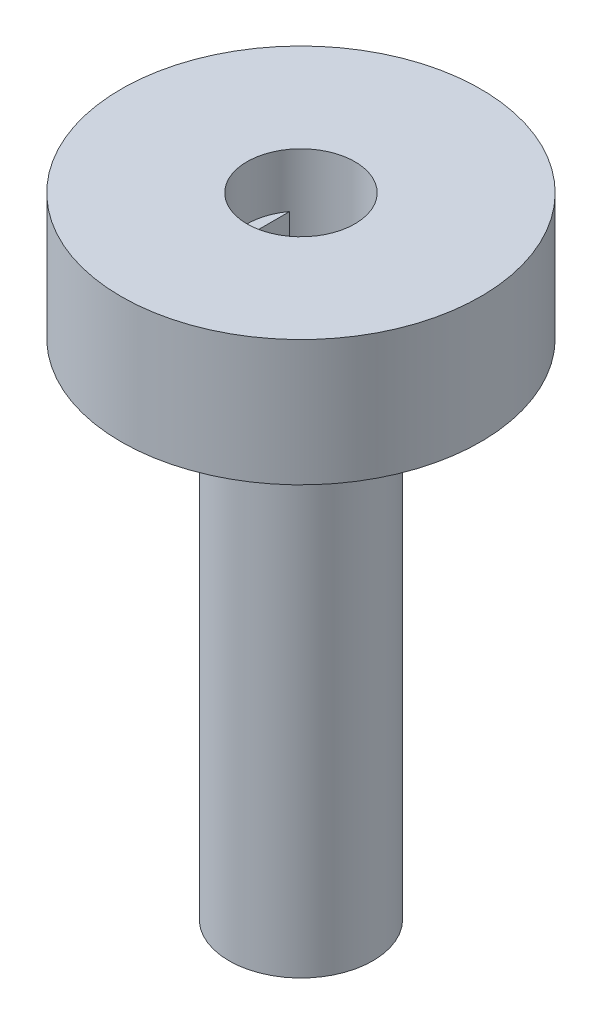
ISO-10303-21;
HEADER;
FILE_DESCRIPTION(('STEP AP214'),'2;1');
FILE_NAME('part.step','',(''),(''),'','','');
FILE_SCHEMA(('AUTOMOTIVE_DESIGN { 1 0 10303 214 1 1 1 1 }'));
ENDSEC;
DATA;
#1=APPLICATION_CONTEXT('core data for automotive mechanical design processes');
#2=APPLICATION_PROTOCOL_DEFINITION('international standard','automotive_design',2000,#1);
#3=PRODUCT_CONTEXT('',#1,'mechanical');
#4=PRODUCT('Part','Part','',(#3));
#5=PRODUCT_RELATED_PRODUCT_CATEGORY('part','',(#4));
#6=PRODUCT_DEFINITION_FORMATION('','',#4);
#7=PRODUCT_DEFINITION_CONTEXT('part definition',#1,'design');
#8=PRODUCT_DEFINITION('design','',#6,#7);
#9=PRODUCT_DEFINITION_SHAPE('','',#8);
#10=(LENGTH_UNIT() NAMED_UNIT(*) SI_UNIT(.MILLI.,.METRE.));
#11=(NAMED_UNIT(*) PLANE_ANGLE_UNIT() SI_UNIT($,.RADIAN.));
#12=(NAMED_UNIT(*) SI_UNIT($,.STERADIAN.) SOLID_ANGLE_UNIT());
#13=UNCERTAINTY_MEASURE_WITH_UNIT(LENGTH_MEASURE(1.E-05),#10,'distance_accuracy_value','');
#14=(GEOMETRIC_REPRESENTATION_CONTEXT(3) GLOBAL_UNCERTAINTY_ASSIGNED_CONTEXT((#13)) GLOBAL_UNIT_ASSIGNED_CONTEXT((#10,
#11,#12)) REPRESENTATION_CONTEXT('',''));
#15=CARTESIAN_POINT('',(0.,0.,0.));
#16=DIRECTION('',(0.,0.,1.));
#17=DIRECTION('',(1.,0.,0.));
#18=AXIS2_PLACEMENT_3D('',#15,#16,#17);
#19=CARTESIAN_POINT('',(0.,0.,0.));
#20=DIRECTION('',(0.,1.,0.));
#21=DIRECTION('',(0.,0.,1.));
#22=AXIS2_PLACEMENT_3D('',#19,#20,#21);
#23=PLANE('',#22);
#24=CARTESIAN_POINT('',(0.,0.,0.));
#25=DIRECTION('',(0.,1.,0.));
#26=DIRECTION('',(0.,0.,1.));
#27=AXIS2_PLACEMENT_3D('',#24,#25,#26);
#28=CIRCLE('',#27,3.);
#29=CARTESIAN_POINT('',(0.,0.,3.));
#30=VERTEX_POINT('',#29);
#31=EDGE_CURVE('E77',#30,#30,#28,.T.);
#32=ORIENTED_EDGE('',*,*,#31,.F.);
#33=EDGE_LOOP('',(#32));
#34=FACE_BOUND('',#33,.T.);
#35=CARTESIAN_POINT('',(0.,0.,0.));
#36=DIRECTION('',(0.,1.,0.));
#37=DIRECTION('',(0.,0.,1.));
#38=AXIS2_PLACEMENT_3D('',#35,#36,#37);
#39=CIRCLE('',#38,10.);
#40=CARTESIAN_POINT('',(0.,0.,10.));
#41=VERTEX_POINT('',#40);
#42=EDGE_CURVE('E96',#41,#41,#39,.T.);
#43=ORIENTED_EDGE('',*,*,#42,.T.);
#44=EDGE_LOOP('',(#43));
#45=FACE_BOUND('',#44,.T.);
#46=ADVANCED_FACE('F45',(#34,#45),#23,.T.);
#47=CARTESIAN_POINT('',(0.,-13.,0.));
#48=DIRECTION('',(0.,1.,0.));
#49=DIRECTION('',(0.,0.,1.));
#50=AXIS2_PLACEMENT_3D('',#47,#48,#49);
#51=CYLINDRICAL_SURFACE('',#50,3.);
#52=CARTESIAN_POINT('',(0.,-3.,0.));
#53=DIRECTION('',(0.,1.,0.));
#54=DIRECTION('',(0.,0.,1.));
#55=AXIS2_PLACEMENT_3D('',#52,#53,#54);
#56=CIRCLE('',#55,3.);
#57=CARTESIAN_POINT('',(-2.41,-3.,-1.78658892865707));
#58=VERTEX_POINT('',#57);
#59=CARTESIAN_POINT('',(-2.41,-3.,1.78658892865707));
#60=VERTEX_POINT('',#59);
#61=EDGE_CURVE('E61',#58,#60,#56,.T.);
#62=ORIENTED_EDGE('',*,*,#61,.F.);
#63=DIRECTION('',(0.,-1.,0.));
#64=VECTOR('',#63,1.);
#65=CARTESIAN_POINT('',(-2.41,-3.,-1.78658892865707));
#66=LINE('',#65,#64);
#67=CARTESIAN_POINT('',(-2.41,-13.,-1.78658892865707));
#68=VERTEX_POINT('',#67);
#69=EDGE_CURVE('E79',#58,#68,#66,.T.);
#70=ORIENTED_EDGE('',*,*,#69,.T.);
#71=CARTESIAN_POINT('',(0.,-13.,0.));
#72=DIRECTION('',(0.,1.,0.));
#73=DIRECTION('',(0.,0.,1.));
#74=AXIS2_PLACEMENT_3D('',#71,#72,#73);
#75=CIRCLE('',#74,3.);
#76=CARTESIAN_POINT('',(-2.41,-13.,1.78658892865707));
#77=VERTEX_POINT('',#76);
#78=EDGE_CURVE('E54',#77,#68,#75,.T.);
#79=ORIENTED_EDGE('',*,*,#78,.F.);
#80=DIRECTION('',(0.,-1.,0.));
#81=VECTOR('',#80,1.);
#82=CARTESIAN_POINT('',(-2.41,-3.,1.78658892865707));
#83=LINE('',#82,#81);
#84=EDGE_CURVE('E66',#60,#77,#83,.T.);
#85=ORIENTED_EDGE('',*,*,#84,.F.);
#86=EDGE_LOOP('',(#62,#70,#79,#85));
#87=FACE_BOUND('',#86,.T.);
#88=ORIENTED_EDGE('',*,*,#31,.T.);
#89=EDGE_LOOP('',(#88));
#90=FACE_BOUND('',#89,.T.);
#91=ADVANCED_FACE('F80',(#87,#90),#51,.F.);
#92=CARTESIAN_POINT('',(0.,-13.,0.));
#93=DIRECTION('',(0.,1.,0.));
#94=DIRECTION('',(0.,0.,1.));
#95=AXIS2_PLACEMENT_3D('',#92,#93,#94);
#96=PLANE('',#95);
#97=DIRECTION('',(0.,0.,1.));
#98=VECTOR('',#97,1.);
#99=CARTESIAN_POINT('',(-2.41,-13.,0.));
#100=LINE('',#99,#98);
#101=EDGE_CURVE('E75',#68,#77,#100,.T.);
#102=ORIENTED_EDGE('',*,*,#101,.T.);
#103=ORIENTED_EDGE('',*,*,#78,.T.);
#104=EDGE_LOOP('',(#102,#103));
#105=FACE_BOUND('',#104,.T.);
#106=ADVANCED_FACE('F73',(#105),#96,.T.);
#107=CARTESIAN_POINT('',(-2.41,-3.,0.));
#108=DIRECTION('',(1.,0.,0.));
#109=DIRECTION('',(0.,0.,-1.));
#110=AXIS2_PLACEMENT_3D('',#107,#108,#109);
#111=PLANE('',#110);
#112=ORIENTED_EDGE('',*,*,#101,.F.);
#113=ORIENTED_EDGE('',*,*,#69,.F.);
#114=DIRECTION('',(0.,0.,1.));
#115=VECTOR('',#114,1.);
#116=CARTESIAN_POINT('',(-2.41,-3.,0.));
#117=LINE('',#116,#115);
#118=EDGE_CURVE('E89',#58,#60,#117,.T.);
#119=ORIENTED_EDGE('',*,*,#118,.T.);
#120=ORIENTED_EDGE('',*,*,#84,.T.);
#121=EDGE_LOOP('',(#112,#113,#119,#120));
#122=FACE_BOUND('',#121,.T.);
#123=ADVANCED_FACE('F87',(#122),#111,.T.);
#124=CARTESIAN_POINT('',(0.,-3.,0.));
#125=DIRECTION('',(0.,1.,0.));
#126=DIRECTION('',(0.,0.,1.));
#127=AXIS2_PLACEMENT_3D('',#124,#125,#126);
#128=PLANE('',#127);
#129=ORIENTED_EDGE('',*,*,#118,.F.);
#130=ORIENTED_EDGE('',*,*,#61,.T.);
#131=EDGE_LOOP('',(#129,#130));
#132=FACE_BOUND('',#131,.T.);
#133=ADVANCED_FACE('F142',(#132),#128,.T.);
#134=CARTESIAN_POINT('',(0.,-7.,0.));
#135=DIRECTION('',(0.,1.,0.));
#136=DIRECTION('',(0.,0.,1.));
#137=AXIS2_PLACEMENT_3D('',#134,#135,#136);
#138=CYLINDRICAL_SURFACE('',#137,10.);
#139=CARTESIAN_POINT('',(0.,-7.,0.));
#140=DIRECTION('',(0.,1.,0.));
#141=DIRECTION('',(0.,0.,1.));
#142=AXIS2_PLACEMENT_3D('',#139,#140,#141);
#143=CIRCLE('',#142,10.);
#144=CARTESIAN_POINT('',(0.,-7.,10.));
#145=VERTEX_POINT('',#144);
#146=EDGE_CURVE('E90',#145,#145,#143,.T.);
#147=ORIENTED_EDGE('',*,*,#146,.T.);
#148=EDGE_LOOP('',(#147));
#149=FACE_BOUND('',#148,.T.);
#150=ORIENTED_EDGE('',*,*,#42,.F.);
#151=EDGE_LOOP('',(#150));
#152=FACE_BOUND('',#151,.T.);
#153=ADVANCED_FACE('F133',(#149,#152),#138,.T.);
#154=CARTESIAN_POINT('',(0.,-7.,0.));
#155=DIRECTION('',(0.,1.,0.));
#156=DIRECTION('',(0.,0.,1.));
#157=AXIS2_PLACEMENT_3D('',#154,#155,#156);
#158=PLANE('',#157);
#159=CARTESIAN_POINT('',(0.,-7.,0.));
#160=DIRECTION('',(0.,1.,0.));
#161=DIRECTION('',(0.,0.,1.));
#162=AXIS2_PLACEMENT_3D('',#159,#160,#161);
#163=CIRCLE('',#162,4.);
#164=CARTESIAN_POINT('',(0.,-7.,4.));
#165=VERTEX_POINT('',#164);
#166=EDGE_CURVE('E111',#165,#165,#163,.T.);
#167=ORIENTED_EDGE('',*,*,#166,.T.);
#168=EDGE_LOOP('',(#167));
#169=FACE_BOUND('',#168,.T.);
#170=ORIENTED_EDGE('',*,*,#146,.F.);
#171=EDGE_LOOP('',(#170));
#172=FACE_BOUND('',#171,.T.);
#173=ADVANCED_FACE('F118',(#169,#172),#158,.F.);
#174=CARTESIAN_POINT('',(0.,-35.,0.));
#175=DIRECTION('',(0.,1.,0.));
#176=DIRECTION('',(0.,0.,1.));
#177=AXIS2_PLACEMENT_3D('',#174,#175,#176);
#178=PLANE('',#177);
#179=CARTESIAN_POINT('',(0.,-35.,0.));
#180=DIRECTION('',(0.,1.,0.));
#181=DIRECTION('',(0.,0.,1.));
#182=AXIS2_PLACEMENT_3D('',#179,#180,#181);
#183=CIRCLE('',#182,4.);
#184=CARTESIAN_POINT('',(0.,-35.,4.));
#185=VERTEX_POINT('',#184);
#186=EDGE_CURVE('E11',#185,#185,#183,.T.);
#187=ORIENTED_EDGE('',*,*,#186,.F.);
#188=EDGE_LOOP('',(#187));
#189=FACE_BOUND('',#188,.T.);
#190=ADVANCED_FACE('F122',(#189),#178,.F.);
#191=CARTESIAN_POINT('',(0.,-35.,0.));
#192=DIRECTION('',(0.,1.,0.));
#193=DIRECTION('',(0.,0.,1.));
#194=AXIS2_PLACEMENT_3D('',#191,#192,#193);
#195=CYLINDRICAL_SURFACE('',#194,4.);
#196=ORIENTED_EDGE('',*,*,#186,.T.);
#197=EDGE_LOOP('',(#196));
#198=FACE_BOUND('',#197,.T.);
#199=ORIENTED_EDGE('',*,*,#166,.F.);
#200=EDGE_LOOP('',(#199));
#201=FACE_BOUND('',#200,.T.);
#202=ADVANCED_FACE('F47',(#198,#201),#195,.T.);
#203=CLOSED_SHELL('',(#46,#91,#106,#123,#133,#153,#173,#190,#202));
#204=MANIFOLD_SOLID_BREP('B2',#203);
#205=ADVANCED_BREP_SHAPE_REPRESENTATION('',(#18,#204),#14);
#206=SHAPE_DEFINITION_REPRESENTATION(#9,#205);
ENDSEC;
END-ISO-10303-21;
